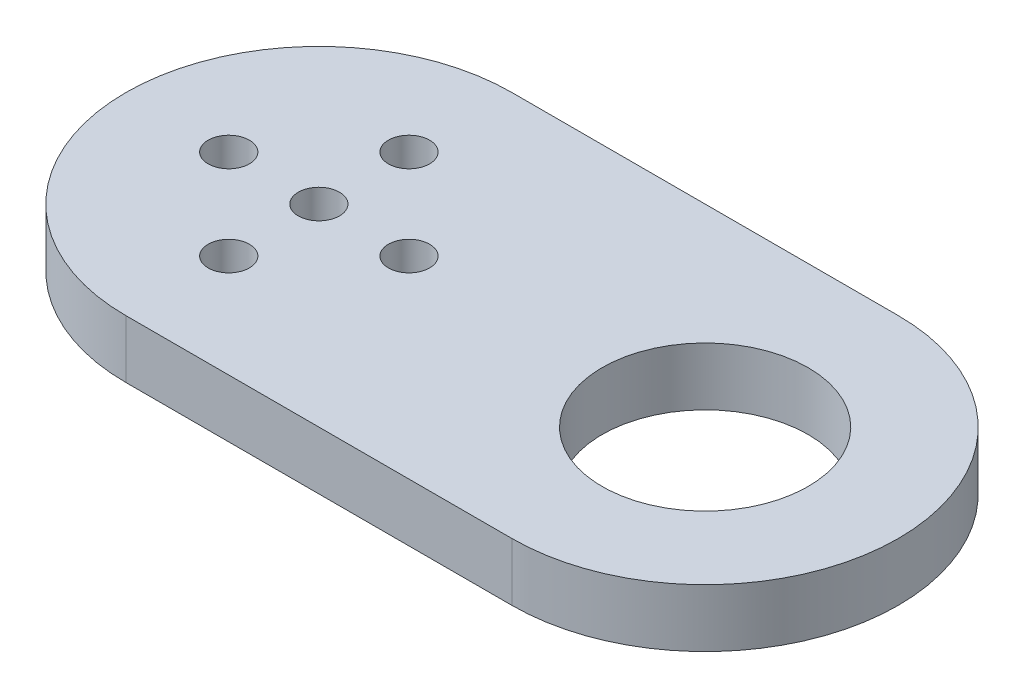
ISO-10303-21;
HEADER;
FILE_DESCRIPTION(('STEP AP214'),'2;1');
FILE_NAME('part.step','',(''),(''),'','','');
FILE_SCHEMA(('AUTOMOTIVE_DESIGN { 1 0 10303 214 1 1 1 1 }'));
ENDSEC;
DATA;
#1=APPLICATION_CONTEXT('core data for automotive mechanical design processes');
#2=APPLICATION_PROTOCOL_DEFINITION('international standard','automotive_design',2000,#1);
#3=PRODUCT_CONTEXT('',#1,'mechanical');
#4=PRODUCT('Part','Part','',(#3));
#5=PRODUCT_RELATED_PRODUCT_CATEGORY('part','',(#4));
#6=PRODUCT_DEFINITION_FORMATION('','',#4);
#7=PRODUCT_DEFINITION_CONTEXT('part definition',#1,'design');
#8=PRODUCT_DEFINITION('design','',#6,#7);
#9=PRODUCT_DEFINITION_SHAPE('','',#8);
#10=(LENGTH_UNIT() NAMED_UNIT(*) SI_UNIT(.MILLI.,.METRE.));
#11=(NAMED_UNIT(*) PLANE_ANGLE_UNIT() SI_UNIT($,.RADIAN.));
#12=(NAMED_UNIT(*) SI_UNIT($,.STERADIAN.) SOLID_ANGLE_UNIT());
#13=UNCERTAINTY_MEASURE_WITH_UNIT(LENGTH_MEASURE(1.E-05),#10,'distance_accuracy_value','');
#14=(GEOMETRIC_REPRESENTATION_CONTEXT(3) GLOBAL_UNCERTAINTY_ASSIGNED_CONTEXT((#13)) GLOBAL_UNIT_ASSIGNED_CONTEXT((#10,
#11,#12)) REPRESENTATION_CONTEXT('',''));
#15=CARTESIAN_POINT('',(0.,0.,0.));
#16=DIRECTION('',(0.,0.,1.));
#17=DIRECTION('',(1.,0.,0.));
#18=AXIS2_PLACEMENT_3D('',#15,#16,#17);
#19=CARTESIAN_POINT('',(15.,4.5,0.));
#20=DIRECTION('',(0.,-1.,0.));
#21=DIRECTION('',(0.,0.,-1.));
#22=AXIS2_PLACEMENT_3D('',#19,#20,#21);
#23=CYLINDRICAL_SURFACE('',#22,15.);
#24=CARTESIAN_POINT('',(15.,0.,0.));
#25=DIRECTION('',(0.,1.,0.));
#26=DIRECTION('',(0.,0.,-1.));
#27=AXIS2_PLACEMENT_3D('',#24,#25,#26);
#28=CIRCLE('',#27,15.);
#29=CARTESIAN_POINT('',(15.,0.,15.));
#30=VERTEX_POINT('',#29);
#31=CARTESIAN_POINT('',(15.,0.,-15.));
#32=VERTEX_POINT('',#31);
#33=EDGE_CURVE('E113',#30,#32,#28,.T.);
#34=ORIENTED_EDGE('',*,*,#33,.T.);
#35=DIRECTION('',(0.,-1.,0.));
#36=VECTOR('',#35,1.);
#37=CARTESIAN_POINT('',(15.,4.5,-15.));
#38=LINE('',#37,#36);
#39=CARTESIAN_POINT('',(15.,4.5,-15.));
#40=VERTEX_POINT('',#39);
#41=EDGE_CURVE('E11',#40,#32,#38,.T.);
#42=ORIENTED_EDGE('',*,*,#41,.F.);
#43=CARTESIAN_POINT('',(15.,4.5,0.));
#44=DIRECTION('',(0.,1.,0.));
#45=DIRECTION('',(0.,0.,-1.));
#46=AXIS2_PLACEMENT_3D('',#43,#44,#45);
#47=CIRCLE('',#46,15.);
#48=CARTESIAN_POINT('',(15.,4.5,15.));
#49=VERTEX_POINT('',#48);
#50=EDGE_CURVE('E97',#49,#40,#47,.T.);
#51=ORIENTED_EDGE('',*,*,#50,.F.);
#52=DIRECTION('',(0.,-1.,0.));
#53=VECTOR('',#52,1.);
#54=CARTESIAN_POINT('',(15.,4.5,15.));
#55=LINE('',#54,#53);
#56=EDGE_CURVE('E109',#49,#30,#55,.T.);
#57=ORIENTED_EDGE('',*,*,#56,.T.);
#58=EDGE_LOOP('',(#34,#42,#51,#57));
#59=FACE_BOUND('',#58,.T.);
#60=ADVANCED_FACE('F45',(#59),#23,.T.);
#61=CARTESIAN_POINT('',(15.,4.5,-15.));
#62=DIRECTION('',(0.,0.,1.));
#63=DIRECTION('',(1.,0.,0.));
#64=AXIS2_PLACEMENT_3D('',#61,#62,#63);
#65=PLANE('',#64);
#66=DIRECTION('',(-1.,0.,0.));
#67=VECTOR('',#66,1.);
#68=CARTESIAN_POINT('',(15.,0.,-15.));
#69=LINE('',#68,#67);
#70=CARTESIAN_POINT('',(-15.,0.,-15.));
#71=VERTEX_POINT('',#70);
#72=EDGE_CURVE('E102',#32,#71,#69,.T.);
#73=ORIENTED_EDGE('',*,*,#72,.T.);
#74=DIRECTION('',(0.,-1.,0.));
#75=VECTOR('',#74,1.);
#76=CARTESIAN_POINT('',(-15.,4.5,-15.));
#77=LINE('',#76,#75);
#78=CARTESIAN_POINT('',(-15.,4.5,-15.));
#79=VERTEX_POINT('',#78);
#80=EDGE_CURVE('E54',#79,#71,#77,.T.);
#81=ORIENTED_EDGE('',*,*,#80,.F.);
#82=DIRECTION('',(-1.,0.,0.));
#83=VECTOR('',#82,1.);
#84=CARTESIAN_POINT('',(15.,4.5,-15.));
#85=LINE('',#84,#83);
#86=EDGE_CURVE('E92',#40,#79,#85,.T.);
#87=ORIENTED_EDGE('',*,*,#86,.F.);
#88=ORIENTED_EDGE('',*,*,#41,.T.);
#89=EDGE_LOOP('',(#73,#81,#87,#88));
#90=FACE_BOUND('',#89,.T.);
#91=ADVANCED_FACE('F101',(#90),#65,.F.);
#92=CARTESIAN_POINT('',(-15.,4.5,0.));
#93=DIRECTION('',(0.,-1.,0.));
#94=DIRECTION('',(0.,0.,-1.));
#95=AXIS2_PLACEMENT_3D('',#92,#93,#94);
#96=CYLINDRICAL_SURFACE('',#95,15.);
#97=CARTESIAN_POINT('',(-15.,0.,0.));
#98=DIRECTION('',(0.,1.,0.));
#99=DIRECTION('',(0.,0.,1.));
#100=AXIS2_PLACEMENT_3D('',#97,#98,#99);
#101=CIRCLE('',#100,15.);
#102=CARTESIAN_POINT('',(-15.,0.,15.));
#103=VERTEX_POINT('',#102);
#104=EDGE_CURVE('E79',#71,#103,#101,.T.);
#105=ORIENTED_EDGE('',*,*,#104,.T.);
#106=DIRECTION('',(0.,-1.,0.));
#107=VECTOR('',#106,1.);
#108=CARTESIAN_POINT('',(-15.,4.5,15.));
#109=LINE('',#108,#107);
#110=CARTESIAN_POINT('',(-15.,4.5,15.));
#111=VERTEX_POINT('',#110);
#112=EDGE_CURVE('E104',#111,#103,#109,.T.);
#113=ORIENTED_EDGE('',*,*,#112,.F.);
#114=CARTESIAN_POINT('',(-15.,4.5,0.));
#115=DIRECTION('',(0.,1.,0.));
#116=DIRECTION('',(0.,0.,1.));
#117=AXIS2_PLACEMENT_3D('',#114,#115,#116);
#118=CIRCLE('',#117,15.);
#119=EDGE_CURVE('E95',#79,#111,#118,.T.);
#120=ORIENTED_EDGE('',*,*,#119,.F.);
#121=ORIENTED_EDGE('',*,*,#80,.T.);
#122=EDGE_LOOP('',(#105,#113,#120,#121));
#123=FACE_BOUND('',#122,.T.);
#124=ADVANCED_FACE('F105',(#123),#96,.T.);
#125=CARTESIAN_POINT('',(15.,4.5,15.));
#126=DIRECTION('',(0.,0.,-1.));
#127=DIRECTION('',(-1.,0.,0.));
#128=AXIS2_PLACEMENT_3D('',#125,#126,#127);
#129=PLANE('',#128);
#130=DIRECTION('',(1.,0.,0.));
#131=VECTOR('',#130,1.);
#132=CARTESIAN_POINT('',(15.,0.,15.));
#133=LINE('',#132,#131);
#134=EDGE_CURVE('E85',#103,#30,#133,.T.);
#135=ORIENTED_EDGE('',*,*,#134,.T.);
#136=ORIENTED_EDGE('',*,*,#56,.F.);
#137=DIRECTION('',(1.,0.,0.));
#138=VECTOR('',#137,1.);
#139=CARTESIAN_POINT('',(15.,4.5,15.));
#140=LINE('',#139,#138);
#141=EDGE_CURVE('E62',#111,#49,#140,.T.);
#142=ORIENTED_EDGE('',*,*,#141,.F.);
#143=ORIENTED_EDGE('',*,*,#112,.T.);
#144=EDGE_LOOP('',(#135,#136,#142,#143));
#145=FACE_BOUND('',#144,.T.);
#146=ADVANCED_FACE('F127',(#145),#129,.F.);
#147=CARTESIAN_POINT('',(15.,4.5,0.));
#148=DIRECTION('',(0.,-1.,0.));
#149=DIRECTION('',(0.,0.,-1.));
#150=AXIS2_PLACEMENT_3D('',#147,#148,#149);
#151=PLANE('',#150);
#152=CARTESIAN_POINT('',(15.,4.5,0.));
#153=DIRECTION('',(0.,-1.,0.));
#154=DIRECTION('',(0.,0.,-1.));
#155=AXIS2_PLACEMENT_3D('',#152,#153,#154);
#156=CIRCLE('',#155,8.);
#157=CARTESIAN_POINT('',(15.,4.5,-8.));
#158=VERTEX_POINT('',#157);
#159=EDGE_CURVE('E163',#158,#158,#156,.T.);
#160=ORIENTED_EDGE('',*,*,#159,.T.);
#161=EDGE_LOOP('',(#160));
#162=FACE_BOUND('',#161,.T.);
#163=CARTESIAN_POINT('',(-8.,4.5,0.));
#164=DIRECTION('',(0.,1.,0.));
#165=DIRECTION('',(0.,0.,1.));
#166=AXIS2_PLACEMENT_3D('',#163,#164,#165);
#167=CIRCLE('',#166,1.6);
#168=CARTESIAN_POINT('',(-8.,4.5,1.6));
#169=VERTEX_POINT('',#168);
#170=EDGE_CURVE('E138',#169,#169,#167,.T.);
#171=ORIENTED_EDGE('',*,*,#170,.F.);
#172=EDGE_LOOP('',(#171));
#173=FACE_BOUND('',#172,.T.);
#174=CARTESIAN_POINT('',(-14.9999999999998,4.5,7.00000000000019));
#175=DIRECTION('',(0.,1.,0.));
#176=DIRECTION('',(0.,0.,1.));
#177=AXIS2_PLACEMENT_3D('',#174,#175,#176);
#178=CIRCLE('',#177,1.6);
#179=CARTESIAN_POINT('',(-14.9999999999998,4.5,8.6000000000002));
#180=VERTEX_POINT('',#179);
#181=EDGE_CURVE('E146',#180,#180,#178,.T.);
#182=ORIENTED_EDGE('',*,*,#181,.F.);
#183=EDGE_LOOP('',(#182));
#184=FACE_BOUND('',#183,.T.);
#185=CARTESIAN_POINT('',(-22.,4.5,3.40375073105368E-13));
#186=DIRECTION('',(0.,1.,0.));
#187=DIRECTION('',(0.,0.,1.));
#188=AXIS2_PLACEMENT_3D('',#185,#186,#187);
#189=CIRCLE('',#188,1.6);
#190=CARTESIAN_POINT('',(-22.,4.5,1.60000000000034));
#191=VERTEX_POINT('',#190);
#192=EDGE_CURVE('E147',#191,#191,#189,.T.);
#193=ORIENTED_EDGE('',*,*,#192,.F.);
#194=EDGE_LOOP('',(#193));
#195=FACE_BOUND('',#194,.T.);
#196=CARTESIAN_POINT('',(-15.0000000000001,4.5,-6.99999999999981));
#197=DIRECTION('',(0.,1.,0.));
#198=DIRECTION('',(0.,0.,1.));
#199=AXIS2_PLACEMENT_3D('',#196,#197,#198);
#200=CIRCLE('',#199,1.6);
#201=CARTESIAN_POINT('',(-15.0000000000001,4.5,-5.39999999999981));
#202=VERTEX_POINT('',#201);
#203=EDGE_CURVE('E162',#202,#202,#200,.T.);
#204=ORIENTED_EDGE('',*,*,#203,.F.);
#205=EDGE_LOOP('',(#204));
#206=FACE_BOUND('',#205,.T.);
#207=CARTESIAN_POINT('',(-15.,4.5,0.));
#208=DIRECTION('',(0.,1.,0.));
#209=DIRECTION('',(0.,0.,1.));
#210=AXIS2_PLACEMENT_3D('',#207,#208,#209);
#211=CIRCLE('',#210,1.6);
#212=CARTESIAN_POINT('',(-15.,4.5,1.6));
#213=VERTEX_POINT('',#212);
#214=EDGE_CURVE('E134',#213,#213,#211,.T.);
#215=ORIENTED_EDGE('',*,*,#214,.F.);
#216=EDGE_LOOP('',(#215));
#217=FACE_BOUND('',#216,.T.);
#218=ORIENTED_EDGE('',*,*,#50,.T.);
#219=ORIENTED_EDGE('',*,*,#86,.T.);
#220=ORIENTED_EDGE('',*,*,#119,.T.);
#221=ORIENTED_EDGE('',*,*,#141,.T.);
#222=EDGE_LOOP('',(#218,#219,#220,#221));
#223=FACE_BOUND('',#222,.T.);
#224=ADVANCED_FACE('F93',(#162,#173,#184,#195,#206,#217,#223),#151,.F.);
#225=CARTESIAN_POINT('',(15.,0.,0.));
#226=DIRECTION('',(0.,-1.,0.));
#227=DIRECTION('',(0.,0.,-1.));
#228=AXIS2_PLACEMENT_3D('',#225,#226,#227);
#229=PLANE('',#228);
#230=CARTESIAN_POINT('',(15.,0.,0.));
#231=DIRECTION('',(0.,-1.,0.));
#232=DIRECTION('',(0.,0.,-1.));
#233=AXIS2_PLACEMENT_3D('',#230,#231,#232);
#234=CIRCLE('',#233,8.);
#235=CARTESIAN_POINT('',(15.,0.,-8.));
#236=VERTEX_POINT('',#235);
#237=EDGE_CURVE('E174',#236,#236,#234,.T.);
#238=ORIENTED_EDGE('',*,*,#237,.F.);
#239=EDGE_LOOP('',(#238));
#240=FACE_BOUND('',#239,.T.);
#241=CARTESIAN_POINT('',(-8.,0.,0.));
#242=DIRECTION('',(0.,1.,0.));
#243=DIRECTION('',(0.,0.,1.));
#244=AXIS2_PLACEMENT_3D('',#241,#242,#243);
#245=CIRCLE('',#244,1.6);
#246=CARTESIAN_POINT('',(-8.,0.,1.6));
#247=VERTEX_POINT('',#246);
#248=EDGE_CURVE('E151',#247,#247,#245,.T.);
#249=ORIENTED_EDGE('',*,*,#248,.T.);
#250=EDGE_LOOP('',(#249));
#251=FACE_BOUND('',#250,.T.);
#252=CARTESIAN_POINT('',(-14.9999999999998,0.,7.00000000000019));
#253=DIRECTION('',(0.,1.,0.));
#254=DIRECTION('',(0.,0.,1.));
#255=AXIS2_PLACEMENT_3D('',#252,#253,#254);
#256=CIRCLE('',#255,1.6);
#257=CARTESIAN_POINT('',(-14.9999999999998,0.,8.6000000000002));
#258=VERTEX_POINT('',#257);
#259=EDGE_CURVE('E142',#258,#258,#256,.T.);
#260=ORIENTED_EDGE('',*,*,#259,.T.);
#261=EDGE_LOOP('',(#260));
#262=FACE_BOUND('',#261,.T.);
#263=CARTESIAN_POINT('',(-22.,0.,3.40375073105368E-13));
#264=DIRECTION('',(0.,1.,0.));
#265=DIRECTION('',(0.,0.,1.));
#266=AXIS2_PLACEMENT_3D('',#263,#264,#265);
#267=CIRCLE('',#266,1.6);
#268=CARTESIAN_POINT('',(-22.,0.,1.60000000000034));
#269=VERTEX_POINT('',#268);
#270=EDGE_CURVE('E167',#269,#269,#267,.T.);
#271=ORIENTED_EDGE('',*,*,#270,.T.);
#272=EDGE_LOOP('',(#271));
#273=FACE_BOUND('',#272,.T.);
#274=CARTESIAN_POINT('',(-15.0000000000001,0.,-6.99999999999981));
#275=DIRECTION('',(0.,1.,0.));
#276=DIRECTION('',(0.,0.,1.));
#277=AXIS2_PLACEMENT_3D('',#274,#275,#276);
#278=CIRCLE('',#277,1.6);
#279=CARTESIAN_POINT('',(-15.0000000000001,0.,-5.39999999999981));
#280=VERTEX_POINT('',#279);
#281=EDGE_CURVE('E158',#280,#280,#278,.T.);
#282=ORIENTED_EDGE('',*,*,#281,.T.);
#283=EDGE_LOOP('',(#282));
#284=FACE_BOUND('',#283,.T.);
#285=CARTESIAN_POINT('',(-15.,0.,0.));
#286=DIRECTION('',(0.,1.,0.));
#287=DIRECTION('',(0.,0.,1.));
#288=AXIS2_PLACEMENT_3D('',#285,#286,#287);
#289=CIRCLE('',#288,1.6);
#290=CARTESIAN_POINT('',(-15.,0.,1.6));
#291=VERTEX_POINT('',#290);
#292=EDGE_CURVE('E117',#291,#291,#289,.T.);
#293=ORIENTED_EDGE('',*,*,#292,.T.);
#294=EDGE_LOOP('',(#293));
#295=FACE_BOUND('',#294,.T.);
#296=ORIENTED_EDGE('',*,*,#33,.F.);
#297=ORIENTED_EDGE('',*,*,#134,.F.);
#298=ORIENTED_EDGE('',*,*,#104,.F.);
#299=ORIENTED_EDGE('',*,*,#72,.F.);
#300=EDGE_LOOP('',(#296,#297,#298,#299));
#301=FACE_BOUND('',#300,.T.);
#302=ADVANCED_FACE('F130',(#240,#251,#262,#273,#284,#295,#301),#229,.T.);
#303=CARTESIAN_POINT('',(-15.,0.,0.));
#304=DIRECTION('',(0.,1.,0.));
#305=DIRECTION('',(0.,0.,1.));
#306=AXIS2_PLACEMENT_3D('',#303,#304,#305);
#307=CYLINDRICAL_SURFACE('',#306,1.6);
#308=ORIENTED_EDGE('',*,*,#292,.F.);
#309=EDGE_LOOP('',(#308));
#310=FACE_BOUND('',#309,.T.);
#311=ORIENTED_EDGE('',*,*,#214,.T.);
#312=EDGE_LOOP('',(#311));
#313=FACE_BOUND('',#312,.T.);
#314=ADVANCED_FACE('F193',(#310,#313),#307,.F.);
#315=CARTESIAN_POINT('',(-15.0000000000001,0.,-6.99999999999981));
#316=DIRECTION('',(0.,1.,0.));
#317=DIRECTION('',(0.,0.,1.));
#318=AXIS2_PLACEMENT_3D('',#315,#316,#317);
#319=CYLINDRICAL_SURFACE('',#318,1.6);
#320=ORIENTED_EDGE('',*,*,#281,.F.);
#321=EDGE_LOOP('',(#320));
#322=FACE_BOUND('',#321,.T.);
#323=ORIENTED_EDGE('',*,*,#203,.T.);
#324=EDGE_LOOP('',(#323));
#325=FACE_BOUND('',#324,.T.);
#326=ADVANCED_FACE('F207',(#322,#325),#319,.F.);
#327=CARTESIAN_POINT('',(-22.,0.,3.40375073105368E-13));
#328=DIRECTION('',(0.,1.,0.));
#329=DIRECTION('',(0.,0.,1.));
#330=AXIS2_PLACEMENT_3D('',#327,#328,#329);
#331=CYLINDRICAL_SURFACE('',#330,1.6);
#332=ORIENTED_EDGE('',*,*,#270,.F.);
#333=EDGE_LOOP('',(#332));
#334=FACE_BOUND('',#333,.T.);
#335=ORIENTED_EDGE('',*,*,#192,.T.);
#336=EDGE_LOOP('',(#335));
#337=FACE_BOUND('',#336,.T.);
#338=ADVANCED_FACE('F246',(#334,#337),#331,.F.);
#339=CARTESIAN_POINT('',(-14.9999999999998,0.,7.00000000000019));
#340=DIRECTION('',(0.,1.,0.));
#341=DIRECTION('',(0.,0.,1.));
#342=AXIS2_PLACEMENT_3D('',#339,#340,#341);
#343=CYLINDRICAL_SURFACE('',#342,1.6);
#344=ORIENTED_EDGE('',*,*,#259,.F.);
#345=EDGE_LOOP('',(#344));
#346=FACE_BOUND('',#345,.T.);
#347=ORIENTED_EDGE('',*,*,#181,.T.);
#348=EDGE_LOOP('',(#347));
#349=FACE_BOUND('',#348,.T.);
#350=ADVANCED_FACE('F255',(#346,#349),#343,.F.);
#351=CARTESIAN_POINT('',(-8.,0.,0.));
#352=DIRECTION('',(0.,1.,0.));
#353=DIRECTION('',(0.,0.,1.));
#354=AXIS2_PLACEMENT_3D('',#351,#352,#353);
#355=CYLINDRICAL_SURFACE('',#354,1.6);
#356=ORIENTED_EDGE('',*,*,#248,.F.);
#357=EDGE_LOOP('',(#356));
#358=FACE_BOUND('',#357,.T.);
#359=ORIENTED_EDGE('',*,*,#170,.T.);
#360=EDGE_LOOP('',(#359));
#361=FACE_BOUND('',#360,.T.);
#362=ADVANCED_FACE('F187',(#358,#361),#355,.F.);
#363=CARTESIAN_POINT('',(15.,4.5,0.));
#364=DIRECTION('',(0.,-1.,0.));
#365=DIRECTION('',(0.,0.,-1.));
#366=AXIS2_PLACEMENT_3D('',#363,#364,#365);
#367=CYLINDRICAL_SURFACE('',#366,8.);
#368=ORIENTED_EDGE('',*,*,#159,.F.);
#369=EDGE_LOOP('',(#368));
#370=FACE_BOUND('',#369,.T.);
#371=ORIENTED_EDGE('',*,*,#237,.T.);
#372=EDGE_LOOP('',(#371));
#373=FACE_BOUND('',#372,.T.);
#374=ADVANCED_FACE('F184',(#370,#373),#367,.F.);
#375=CLOSED_SHELL('',(#60,#91,#124,#146,#224,#302,#314,#326,#338,#350,#362,#374));
#376=MANIFOLD_SOLID_BREP('B2',#375);
#377=ADVANCED_BREP_SHAPE_REPRESENTATION('',(#18,#376),#14);
#378=SHAPE_DEFINITION_REPRESENTATION(#9,#377);
ENDSEC;
END-ISO-10303-21;
